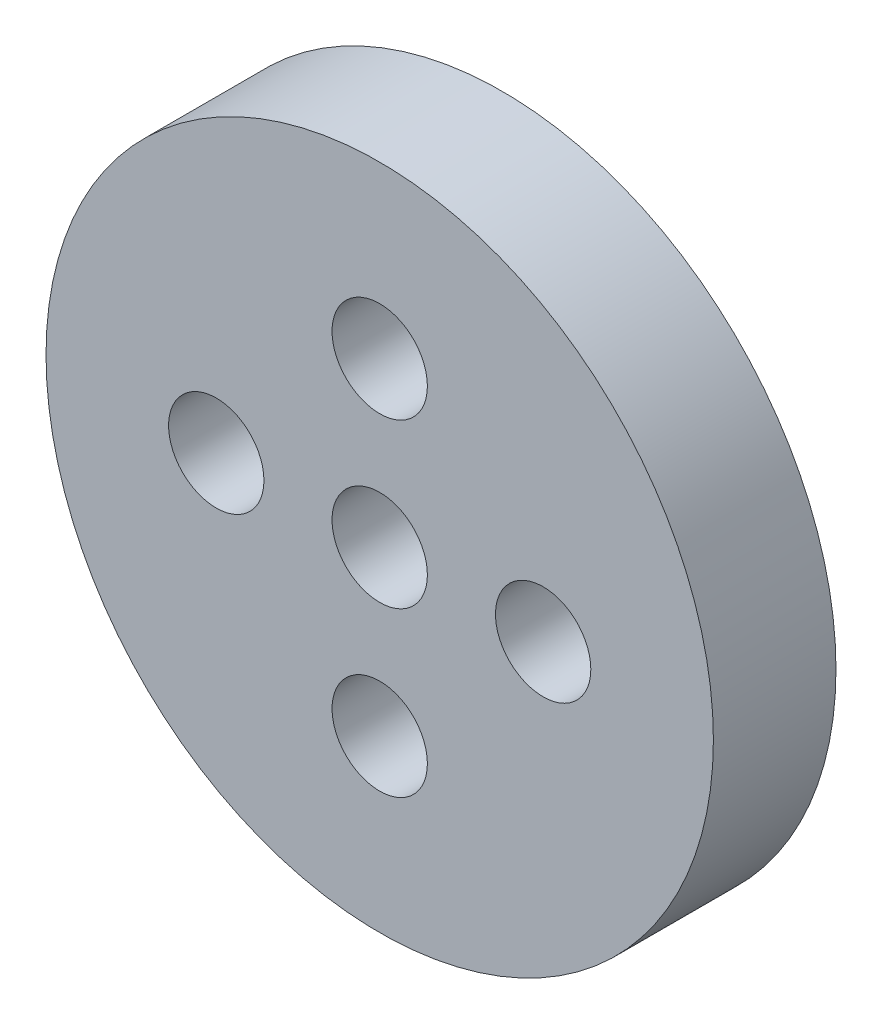
ISO-10303-21;
HEADER;
FILE_DESCRIPTION(('STEP AP214'),'2;1');
FILE_NAME('part.step','',(''),(''),'','','');
FILE_SCHEMA(('AUTOMOTIVE_DESIGN { 1 0 10303 214 1 1 1 1 }'));
ENDSEC;
DATA;
#1=APPLICATION_CONTEXT('core data for automotive mechanical design processes');
#2=APPLICATION_PROTOCOL_DEFINITION('international standard','automotive_design',2000,#1);
#3=PRODUCT_CONTEXT('',#1,'mechanical');
#4=PRODUCT('Part','Part','',(#3));
#5=PRODUCT_RELATED_PRODUCT_CATEGORY('part','',(#4));
#6=PRODUCT_DEFINITION_FORMATION('','',#4);
#7=PRODUCT_DEFINITION_CONTEXT('part definition',#1,'design');
#8=PRODUCT_DEFINITION('design','',#6,#7);
#9=PRODUCT_DEFINITION_SHAPE('','',#8);
#10=(LENGTH_UNIT() NAMED_UNIT(*) SI_UNIT(.MILLI.,.METRE.));
#11=(NAMED_UNIT(*) PLANE_ANGLE_UNIT() SI_UNIT($,.RADIAN.));
#12=(NAMED_UNIT(*) SI_UNIT($,.STERADIAN.) SOLID_ANGLE_UNIT());
#13=UNCERTAINTY_MEASURE_WITH_UNIT(LENGTH_MEASURE(1.E-05),#10,'distance_accuracy_value','');
#14=(GEOMETRIC_REPRESENTATION_CONTEXT(3) GLOBAL_UNCERTAINTY_ASSIGNED_CONTEXT((#13)) GLOBAL_UNIT_ASSIGNED_CONTEXT((#10,
#11,#12)) REPRESENTATION_CONTEXT('',''));
#15=CARTESIAN_POINT('',(0.,0.,0.));
#16=DIRECTION('',(0.,0.,1.));
#17=DIRECTION('',(1.,0.,0.));
#18=AXIS2_PLACEMENT_3D('',#15,#16,#17);
#19=CARTESIAN_POINT('',(-21.9978998751723,9.44386107643675,9.));
#20=DIRECTION('',(0.,0.,-1.));
#21=DIRECTION('',(-1.,0.,0.));
#22=AXIS2_PLACEMENT_3D('',#19,#20,#21);
#23=CYLINDRICAL_SURFACE('',#22,3.5);
#24=CARTESIAN_POINT('',(-21.9978998751723,9.44386107643675,2.));
#25=DIRECTION('',(0.,0.,1.));
#26=DIRECTION('',(1.,0.,0.));
#27=AXIS2_PLACEMENT_3D('',#24,#25,#26);
#28=CIRCLE('',#27,3.5);
#29=CARTESIAN_POINT('',(-18.4978998751723,9.44386107643675,2.));
#30=VERTEX_POINT('',#29);
#31=EDGE_CURVE('E52',#30,#30,#28,.T.);
#32=ORIENTED_EDGE('',*,*,#31,.F.);
#33=EDGE_LOOP('',(#32));
#34=FACE_BOUND('',#33,.T.);
#35=CARTESIAN_POINT('',(-21.9978998751723,9.44386107643675,9.));
#36=DIRECTION('',(0.,0.,1.));
#37=DIRECTION('',(1.,0.,0.));
#38=AXIS2_PLACEMENT_3D('',#35,#36,#37);
#39=CIRCLE('',#38,3.5);
#40=CARTESIAN_POINT('',(-18.4978998751723,9.44386107643675,9.));
#41=VERTEX_POINT('',#40);
#42=EDGE_CURVE('E41',#41,#41,#39,.T.);
#43=ORIENTED_EDGE('',*,*,#42,.T.);
#44=EDGE_LOOP('',(#43));
#45=FACE_BOUND('',#44,.T.);
#46=ADVANCED_FACE('F33',(#34,#45),#23,.F.);
#47=CARTESIAN_POINT('',(-21.9978998751725,-2.55613892356325,9.));
#48=DIRECTION('',(0.,0.,-1.));
#49=DIRECTION('',(-1.,0.,0.));
#50=AXIS2_PLACEMENT_3D('',#47,#48,#49);
#51=CYLINDRICAL_SURFACE('',#50,3.5);
#52=CARTESIAN_POINT('',(-21.9978998751725,-2.55613892356325,2.));
#53=DIRECTION('',(0.,0.,1.));
#54=DIRECTION('',(1.,0.,0.));
#55=AXIS2_PLACEMENT_3D('',#52,#53,#54);
#56=CIRCLE('',#55,3.5);
#57=CARTESIAN_POINT('',(-18.4978998751724,-2.55613892356325,2.));
#58=VERTEX_POINT('',#57);
#59=EDGE_CURVE('E59',#58,#58,#56,.T.);
#60=ORIENTED_EDGE('',*,*,#59,.F.);
#61=EDGE_LOOP('',(#60));
#62=FACE_BOUND('',#61,.T.);
#63=CARTESIAN_POINT('',(-21.9978998751725,-2.55613892356325,9.));
#64=DIRECTION('',(0.,0.,1.));
#65=DIRECTION('',(1.,0.,0.));
#66=AXIS2_PLACEMENT_3D('',#63,#64,#65);
#67=CIRCLE('',#66,3.5);
#68=CARTESIAN_POINT('',(-18.4978998751724,-2.55613892356325,9.));
#69=VERTEX_POINT('',#68);
#70=EDGE_CURVE('E46',#69,#69,#67,.T.);
#71=ORIENTED_EDGE('',*,*,#70,.T.);
#72=EDGE_LOOP('',(#71));
#73=FACE_BOUND('',#72,.T.);
#74=ADVANCED_FACE('F75',(#62,#73),#51,.F.);
#75=CARTESIAN_POINT('',(-9.99789987517233,9.44386107643667,9.));
#76=DIRECTION('',(0.,0.,-1.));
#77=DIRECTION('',(-1.,0.,0.));
#78=AXIS2_PLACEMENT_3D('',#75,#76,#77);
#79=CYLINDRICAL_SURFACE('',#78,3.5);
#80=CARTESIAN_POINT('',(-9.99789987517233,9.44386107643667,2.));
#81=DIRECTION('',(0.,0.,1.));
#82=DIRECTION('',(1.,0.,0.));
#83=AXIS2_PLACEMENT_3D('',#80,#81,#82);
#84=CIRCLE('',#83,3.5);
#85=CARTESIAN_POINT('',(-6.49789987517233,9.44386107643667,2.));
#86=VERTEX_POINT('',#85);
#87=EDGE_CURVE('E64',#86,#86,#84,.T.);
#88=ORIENTED_EDGE('',*,*,#87,.F.);
#89=EDGE_LOOP('',(#88));
#90=FACE_BOUND('',#89,.T.);
#91=CARTESIAN_POINT('',(-9.99789987517233,9.44386107643667,9.));
#92=DIRECTION('',(0.,0.,1.));
#93=DIRECTION('',(1.,0.,0.));
#94=AXIS2_PLACEMENT_3D('',#91,#92,#93);
#95=CIRCLE('',#94,3.5);
#96=CARTESIAN_POINT('',(-6.49789987517233,9.44386107643667,9.));
#97=VERTEX_POINT('',#96);
#98=EDGE_CURVE('E70',#97,#97,#95,.T.);
#99=ORIENTED_EDGE('',*,*,#98,.T.);
#100=EDGE_LOOP('',(#99));
#101=FACE_BOUND('',#100,.T.);
#102=ADVANCED_FACE('F92',(#90,#101),#79,.F.);
#103=CARTESIAN_POINT('',(-21.9978998751723,21.4438610764368,9.));
#104=DIRECTION('',(0.,0.,-1.));
#105=DIRECTION('',(-1.,0.,0.));
#106=AXIS2_PLACEMENT_3D('',#103,#104,#105);
#107=CYLINDRICAL_SURFACE('',#106,3.5);
#108=CARTESIAN_POINT('',(-21.9978998751723,21.4438610764368,2.));
#109=DIRECTION('',(0.,0.,1.));
#110=DIRECTION('',(1.,0.,0.));
#111=AXIS2_PLACEMENT_3D('',#108,#109,#110);
#112=CIRCLE('',#111,3.5);
#113=CARTESIAN_POINT('',(-18.4978998751723,21.4438610764368,2.));
#114=VERTEX_POINT('',#113);
#115=EDGE_CURVE('E110',#114,#114,#112,.T.);
#116=ORIENTED_EDGE('',*,*,#115,.F.);
#117=EDGE_LOOP('',(#116));
#118=FACE_BOUND('',#117,.T.);
#119=CARTESIAN_POINT('',(-21.9978998751723,21.4438610764368,9.));
#120=DIRECTION('',(0.,0.,1.));
#121=DIRECTION('',(1.,0.,0.));
#122=AXIS2_PLACEMENT_3D('',#119,#120,#121);
#123=CIRCLE('',#122,3.5);
#124=CARTESIAN_POINT('',(-18.4978998751723,21.4438610764368,9.));
#125=VERTEX_POINT('',#124);
#126=EDGE_CURVE('E56',#125,#125,#123,.T.);
#127=ORIENTED_EDGE('',*,*,#126,.T.);
#128=EDGE_LOOP('',(#127));
#129=FACE_BOUND('',#128,.T.);
#130=ADVANCED_FACE('F99',(#118,#129),#107,.F.);
#131=CARTESIAN_POINT('',(-33.9978998751723,9.44386107643675,9.));
#132=DIRECTION('',(0.,0.,-1.));
#133=DIRECTION('',(-1.,0.,0.));
#134=AXIS2_PLACEMENT_3D('',#131,#132,#133);
#135=CYLINDRICAL_SURFACE('',#134,3.5);
#136=CARTESIAN_POINT('',(-33.9978998751723,9.44386107643675,2.));
#137=DIRECTION('',(0.,0.,1.));
#138=DIRECTION('',(1.,0.,0.));
#139=AXIS2_PLACEMENT_3D('',#136,#137,#138);
#140=CIRCLE('',#139,3.5);
#141=CARTESIAN_POINT('',(-30.4978998751723,9.44386107643675,2.));
#142=VERTEX_POINT('',#141);
#143=EDGE_CURVE('E37',#142,#142,#140,.T.);
#144=ORIENTED_EDGE('',*,*,#143,.F.);
#145=EDGE_LOOP('',(#144));
#146=FACE_BOUND('',#145,.T.);
#147=CARTESIAN_POINT('',(-33.9978998751723,9.44386107643675,9.));
#148=DIRECTION('',(0.,0.,1.));
#149=DIRECTION('',(1.,0.,0.));
#150=AXIS2_PLACEMENT_3D('',#147,#148,#149);
#151=CIRCLE('',#150,3.5);
#152=CARTESIAN_POINT('',(-30.4978998751723,9.44386107643675,9.));
#153=VERTEX_POINT('',#152);
#154=EDGE_CURVE('E51',#153,#153,#151,.T.);
#155=ORIENTED_EDGE('',*,*,#154,.T.);
#156=EDGE_LOOP('',(#155));
#157=FACE_BOUND('',#156,.T.);
#158=ADVANCED_FACE('F35',(#146,#157),#135,.F.);
#159=CARTESIAN_POINT('',(-21.9978998751723,9.44386107643675,9.));
#160=DIRECTION('',(0.,0.,-1.));
#161=DIRECTION('',(-1.,0.,0.));
#162=AXIS2_PLACEMENT_3D('',#159,#160,#161);
#163=CYLINDRICAL_SURFACE('',#162,24.5);
#164=CARTESIAN_POINT('',(-21.9978998751723,9.44386107643675,9.));
#165=DIRECTION('',(0.,0.,1.));
#166=DIRECTION('',(1.,0.,0.));
#167=AXIS2_PLACEMENT_3D('',#164,#165,#166);
#168=CIRCLE('',#167,24.5);
#169=CARTESIAN_POINT('',(2.50210012482768,9.44386107643675,9.));
#170=VERTEX_POINT('',#169);
#171=EDGE_CURVE('E10',#170,#170,#168,.T.);
#172=ORIENTED_EDGE('',*,*,#171,.F.);
#173=EDGE_LOOP('',(#172));
#174=FACE_BOUND('',#173,.T.);
#175=CARTESIAN_POINT('',(-21.9978998751723,9.44386107643675,0.));
#176=DIRECTION('',(0.,0.,1.));
#177=DIRECTION('',(1.,0.,0.));
#178=AXIS2_PLACEMENT_3D('',#175,#176,#177);
#179=CIRCLE('',#178,24.5);
#180=CARTESIAN_POINT('',(2.50210012482768,9.44386107643675,0.));
#181=VERTEX_POINT('',#180);
#182=EDGE_CURVE('E49',#181,#181,#179,.T.);
#183=ORIENTED_EDGE('',*,*,#182,.T.);
#184=EDGE_LOOP('',(#183));
#185=FACE_BOUND('',#184,.T.);
#186=ADVANCED_FACE('F81',(#174,#185),#163,.T.);
#187=CARTESIAN_POINT('',(0.,0.,9.));
#188=DIRECTION('',(0.,0.,1.));
#189=DIRECTION('',(1.,0.,0.));
#190=AXIS2_PLACEMENT_3D('',#187,#188,#189);
#191=PLANE('',#190);
#192=ORIENTED_EDGE('',*,*,#154,.F.);
#193=EDGE_LOOP('',(#192));
#194=FACE_BOUND('',#193,.T.);
#195=ORIENTED_EDGE('',*,*,#126,.F.);
#196=EDGE_LOOP('',(#195));
#197=FACE_BOUND('',#196,.T.);
#198=ORIENTED_EDGE('',*,*,#98,.F.);
#199=EDGE_LOOP('',(#198));
#200=FACE_BOUND('',#199,.T.);
#201=ORIENTED_EDGE('',*,*,#70,.F.);
#202=EDGE_LOOP('',(#201));
#203=FACE_BOUND('',#202,.T.);
#204=ORIENTED_EDGE('',*,*,#42,.F.);
#205=EDGE_LOOP('',(#204));
#206=FACE_BOUND('',#205,.T.);
#207=ORIENTED_EDGE('',*,*,#171,.T.);
#208=EDGE_LOOP('',(#207));
#209=FACE_BOUND('',#208,.T.);
#210=ADVANCED_FACE('F77',(#194,#197,#200,#203,#206,#209),#191,.T.);
#211=CARTESIAN_POINT('',(0.,0.,0.));
#212=DIRECTION('',(0.,0.,1.));
#213=DIRECTION('',(1.,0.,0.));
#214=AXIS2_PLACEMENT_3D('',#211,#212,#213);
#215=PLANE('',#214);
#216=CARTESIAN_POINT('',(-21.9978998751723,9.44386107643675,0.));
#217=DIRECTION('',(0.,0.,1.));
#218=DIRECTION('',(1.,0.,0.));
#219=AXIS2_PLACEMENT_3D('',#216,#217,#218);
#220=CIRCLE('',#219,18.);
#221=CARTESIAN_POINT('',(-3.99789987517232,9.44386107643675,0.));
#222=VERTEX_POINT('',#221);
#223=EDGE_CURVE('E124',#222,#222,#220,.T.);
#224=ORIENTED_EDGE('',*,*,#223,.T.);
#225=EDGE_LOOP('',(#224));
#226=FACE_BOUND('',#225,.T.);
#227=ORIENTED_EDGE('',*,*,#182,.F.);
#228=EDGE_LOOP('',(#227));
#229=FACE_BOUND('',#228,.T.);
#230=ADVANCED_FACE('F80',(#226,#229),#215,.F.);
#231=CARTESIAN_POINT('',(-21.9978998751723,9.44386107643675,0.));
#232=DIRECTION('',(0.,0.,-1.));
#233=DIRECTION('',(1.,0.,0.));
#234=AXIS2_PLACEMENT_3D('',#231,#232,#233);
#235=CONICAL_SURFACE('',#234,18.,0.78539816339745);
#236=CARTESIAN_POINT('',(-21.9978998751723,9.44386107643675,2.));
#237=DIRECTION('',(0.,0.,1.));
#238=DIRECTION('',(1.,0.,0.));
#239=AXIS2_PLACEMENT_3D('',#236,#237,#238);
#240=CIRCLE('',#239,16.);
#241=CARTESIAN_POINT('',(-5.99789987517233,9.44386107643675,2.));
#242=VERTEX_POINT('',#241);
#243=EDGE_CURVE('E120',#242,#242,#240,.T.);
#244=ORIENTED_EDGE('',*,*,#243,.T.);
#245=EDGE_LOOP('',(#244));
#246=FACE_BOUND('',#245,.T.);
#247=ORIENTED_EDGE('',*,*,#223,.F.);
#248=EDGE_LOOP('',(#247));
#249=FACE_BOUND('',#248,.T.);
#250=ADVANCED_FACE('F130',(#246,#249),#235,.F.);
#251=CARTESIAN_POINT('',(-21.9978998751723,9.44386107643675,2.));
#252=DIRECTION('',(0.,0.,1.));
#253=DIRECTION('',(1.,0.,0.));
#254=AXIS2_PLACEMENT_3D('',#251,#252,#253);
#255=PLANE('',#254);
#256=ORIENTED_EDGE('',*,*,#31,.T.);
#257=EDGE_LOOP('',(#256));
#258=FACE_BOUND('',#257,.T.);
#259=ORIENTED_EDGE('',*,*,#59,.T.);
#260=EDGE_LOOP('',(#259));
#261=FACE_BOUND('',#260,.T.);
#262=ORIENTED_EDGE('',*,*,#87,.T.);
#263=EDGE_LOOP('',(#262));
#264=FACE_BOUND('',#263,.T.);
#265=ORIENTED_EDGE('',*,*,#115,.T.);
#266=EDGE_LOOP('',(#265));
#267=FACE_BOUND('',#266,.T.);
#268=ORIENTED_EDGE('',*,*,#143,.T.);
#269=EDGE_LOOP('',(#268));
#270=FACE_BOUND('',#269,.T.);
#271=ORIENTED_EDGE('',*,*,#243,.F.);
#272=EDGE_LOOP('',(#271));
#273=FACE_BOUND('',#272,.T.);
#274=ADVANCED_FACE('F132',(#258,#261,#264,#267,#270,#273),#255,.F.);
#275=CLOSED_SHELL('',(#46,#74,#102,#130,#158,#186,#210,#230,#250,#274));
#276=MANIFOLD_SOLID_BREP('B2',#275);
#277=ADVANCED_BREP_SHAPE_REPRESENTATION('',(#18,#276),#14);
#278=SHAPE_DEFINITION_REPRESENTATION(#9,#277);
ENDSEC;
END-ISO-10303-21;
